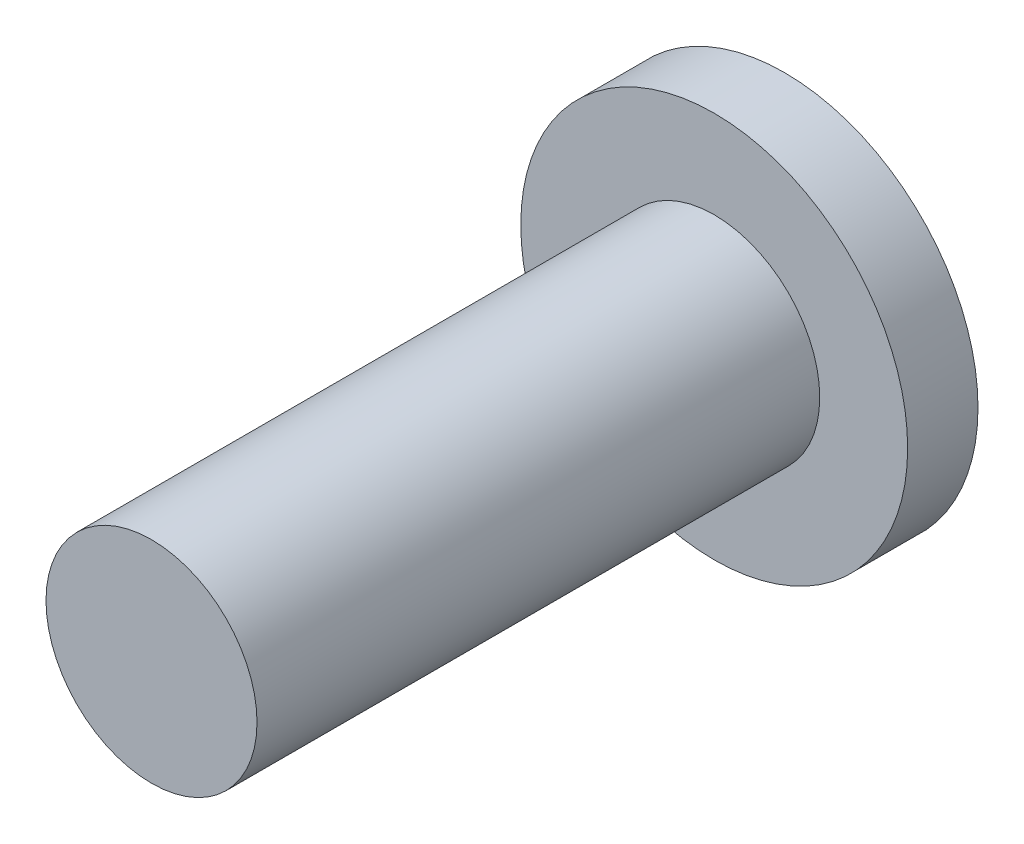
ISO-10303-21;
HEADER;
FILE_DESCRIPTION(('STEP AP214'),'2;1');
FILE_NAME('part.step','',(''),(''),'','','');
FILE_SCHEMA(('AUTOMOTIVE_DESIGN { 1 0 10303 214 1 1 1 1 }'));
ENDSEC;
DATA;
#1=APPLICATION_CONTEXT('core data for automotive mechanical design processes');
#2=APPLICATION_PROTOCOL_DEFINITION('international standard','automotive_design',2000,#1);
#3=PRODUCT_CONTEXT('',#1,'mechanical');
#4=PRODUCT('Part','Part','',(#3));
#5=PRODUCT_RELATED_PRODUCT_CATEGORY('part','',(#4));
#6=PRODUCT_DEFINITION_FORMATION('','',#4);
#7=PRODUCT_DEFINITION_CONTEXT('part definition',#1,'design');
#8=PRODUCT_DEFINITION('design','',#6,#7);
#9=PRODUCT_DEFINITION_SHAPE('','',#8);
#10=(LENGTH_UNIT() NAMED_UNIT(*) SI_UNIT(.MILLI.,.METRE.));
#11=(NAMED_UNIT(*) PLANE_ANGLE_UNIT() SI_UNIT($,.RADIAN.));
#12=(NAMED_UNIT(*) SI_UNIT($,.STERADIAN.) SOLID_ANGLE_UNIT());
#13=UNCERTAINTY_MEASURE_WITH_UNIT(LENGTH_MEASURE(1.E-05),#10,'distance_accuracy_value','');
#14=(GEOMETRIC_REPRESENTATION_CONTEXT(3) GLOBAL_UNCERTAINTY_ASSIGNED_CONTEXT((#13)) GLOBAL_UNIT_ASSIGNED_CONTEXT((#10,
#11,#12)) REPRESENTATION_CONTEXT('',''));
#15=CARTESIAN_POINT('',(0.,0.,0.));
#16=DIRECTION('',(0.,0.,1.));
#17=DIRECTION('',(1.,0.,0.));
#18=AXIS2_PLACEMENT_3D('',#15,#16,#17);
#19=CARTESIAN_POINT('',(0.,0.,0.));
#20=DIRECTION('',(0.,0.,1.));
#21=DIRECTION('',(1.,0.,0.));
#22=AXIS2_PLACEMENT_3D('',#19,#20,#21);
#23=PLANE('',#22);
#24=CARTESIAN_POINT('',(0.,0.,0.));
#25=DIRECTION('',(0.,0.,1.));
#26=DIRECTION('',(1.,0.,0.));
#27=AXIS2_PLACEMENT_3D('',#24,#25,#26);
#28=CIRCLE('',#27,2.75);
#29=CARTESIAN_POINT('',(2.75,0.,0.));
#30=VERTEX_POINT('',#29);
#31=EDGE_CURVE('E41',#30,#30,#28,.T.);
#32=ORIENTED_EDGE('',*,*,#31,.F.);
#33=EDGE_LOOP('',(#32));
#34=FACE_BOUND('',#33,.T.);
#35=DIRECTION('',(0.,1.,0.));
#36=VECTOR('',#35,1.);
#37=CARTESIAN_POINT('',(0.5,0.,0.));
#38=LINE('',#37,#36);
#39=CARTESIAN_POINT('',(0.5,0.5,0.));
#40=VERTEX_POINT('',#39);
#41=CARTESIAN_POINT('',(0.5,1.5,0.));
#42=VERTEX_POINT('',#41);
#43=EDGE_CURVE('E52',#40,#42,#38,.T.);
#44=ORIENTED_EDGE('',*,*,#43,.T.);
#45=DIRECTION('',(-1.,0.,0.));
#46=VECTOR('',#45,1.);
#47=CARTESIAN_POINT('',(0.,1.5,0.));
#48=LINE('',#47,#46);
#49=CARTESIAN_POINT('',(-0.5,1.5,0.));
#50=VERTEX_POINT('',#49);
#51=EDGE_CURVE('E102',#42,#50,#48,.T.);
#52=ORIENTED_EDGE('',*,*,#51,.T.);
#53=DIRECTION('',(0.,1.,0.));
#54=VECTOR('',#53,1.);
#55=CARTESIAN_POINT('',(-0.5,0.,0.));
#56=LINE('',#55,#54);
#57=CARTESIAN_POINT('',(-0.5,0.5,0.));
#58=VERTEX_POINT('',#57);
#59=EDGE_CURVE('E190',#58,#50,#56,.T.);
#60=ORIENTED_EDGE('',*,*,#59,.F.);
#61=DIRECTION('',(-1.,0.,0.));
#62=VECTOR('',#61,1.);
#63=CARTESIAN_POINT('',(0.,0.5,0.));
#64=LINE('',#63,#62);
#65=CARTESIAN_POINT('',(-1.5,0.5,0.));
#66=VERTEX_POINT('',#65);
#67=EDGE_CURVE('E142',#58,#66,#64,.T.);
#68=ORIENTED_EDGE('',*,*,#67,.T.);
#69=DIRECTION('',(0.,1.,0.));
#70=VECTOR('',#69,1.);
#71=CARTESIAN_POINT('',(-1.5,0.,0.));
#72=LINE('',#71,#70);
#73=CARTESIAN_POINT('',(-1.5,-0.5,0.));
#74=VERTEX_POINT('',#73);
#75=EDGE_CURVE('E186',#74,#66,#72,.T.);
#76=ORIENTED_EDGE('',*,*,#75,.F.);
#77=DIRECTION('',(-1.,0.,0.));
#78=VECTOR('',#77,1.);
#79=CARTESIAN_POINT('',(0.,-0.5,0.));
#80=LINE('',#79,#78);
#81=CARTESIAN_POINT('',(-0.5,-0.5,0.));
#82=VERTEX_POINT('',#81);
#83=EDGE_CURVE('E183',#82,#74,#80,.T.);
#84=ORIENTED_EDGE('',*,*,#83,.F.);
#85=DIRECTION('',(0.,1.,0.));
#86=VECTOR('',#85,1.);
#87=CARTESIAN_POINT('',(-0.5,0.,0.));
#88=LINE('',#87,#86);
#89=CARTESIAN_POINT('',(-0.5,-1.5,0.));
#90=VERTEX_POINT('',#89);
#91=EDGE_CURVE('E180',#90,#82,#88,.T.);
#92=ORIENTED_EDGE('',*,*,#91,.F.);
#93=DIRECTION('',(-1.,0.,0.));
#94=VECTOR('',#93,1.);
#95=CARTESIAN_POINT('',(0.,-1.5,0.));
#96=LINE('',#95,#94);
#97=CARTESIAN_POINT('',(0.5,-1.5,0.));
#98=VERTEX_POINT('',#97);
#99=EDGE_CURVE('E177',#98,#90,#96,.T.);
#100=ORIENTED_EDGE('',*,*,#99,.F.);
#101=DIRECTION('',(0.,1.,0.));
#102=VECTOR('',#101,1.);
#103=CARTESIAN_POINT('',(0.5,0.,0.));
#104=LINE('',#103,#102);
#105=CARTESIAN_POINT('',(0.5,-0.5,0.));
#106=VERTEX_POINT('',#105);
#107=EDGE_CURVE('E174',#98,#106,#104,.T.);
#108=ORIENTED_EDGE('',*,*,#107,.T.);
#109=DIRECTION('',(-1.,0.,0.));
#110=VECTOR('',#109,1.);
#111=CARTESIAN_POINT('',(0.,-0.5,0.));
#112=LINE('',#111,#110);
#113=CARTESIAN_POINT('',(1.5,-0.5,0.));
#114=VERTEX_POINT('',#113);
#115=EDGE_CURVE('E171',#114,#106,#112,.T.);
#116=ORIENTED_EDGE('',*,*,#115,.F.);
#117=DIRECTION('',(0.,1.,0.));
#118=VECTOR('',#117,1.);
#119=CARTESIAN_POINT('',(1.5,0.,0.));
#120=LINE('',#119,#118);
#121=CARTESIAN_POINT('',(1.5,0.5,0.));
#122=VERTEX_POINT('',#121);
#123=EDGE_CURVE('E168',#114,#122,#120,.T.);
#124=ORIENTED_EDGE('',*,*,#123,.T.);
#125=DIRECTION('',(-1.,0.,0.));
#126=VECTOR('',#125,1.);
#127=CARTESIAN_POINT('',(0.,0.5,0.));
#128=LINE('',#127,#126);
#129=EDGE_CURVE('E165',#122,#40,#128,.T.);
#130=ORIENTED_EDGE('',*,*,#129,.T.);
#131=EDGE_LOOP('',(#44,#52,#60,#68,#76,#84,#92,#100,#108,#116,#124,#130));
#132=FACE_BOUND('',#131,.T.);
#133=ADVANCED_FACE('F37',(#34,#132),#23,.F.);
#134=CARTESIAN_POINT('',(0.,0.,1.));
#135=DIRECTION('',(0.,0.,1.));
#136=DIRECTION('',(1.,0.,0.));
#137=AXIS2_PLACEMENT_3D('',#134,#135,#136);
#138=PLANE('',#137);
#139=CARTESIAN_POINT('',(0.,0.,1.));
#140=DIRECTION('',(0.,0.,1.));
#141=DIRECTION('',(1.,0.,0.));
#142=AXIS2_PLACEMENT_3D('',#139,#140,#141);
#143=CIRCLE('',#142,2.75);
#144=CARTESIAN_POINT('',(2.75,0.,1.));
#145=VERTEX_POINT('',#144);
#146=EDGE_CURVE('E11',#145,#145,#143,.T.);
#147=ORIENTED_EDGE('',*,*,#146,.T.);
#148=EDGE_LOOP('',(#147));
#149=FACE_BOUND('',#148,.T.);
#150=CARTESIAN_POINT('',(0.,0.,1.));
#151=DIRECTION('',(0.,0.,1.));
#152=DIRECTION('',(1.,0.,0.));
#153=AXIS2_PLACEMENT_3D('',#150,#151,#152);
#154=CIRCLE('',#153,1.5);
#155=CARTESIAN_POINT('',(1.5,0.,1.));
#156=VERTEX_POINT('',#155);
#157=EDGE_CURVE('E196',#156,#156,#154,.T.);
#158=ORIENTED_EDGE('',*,*,#157,.F.);
#159=EDGE_LOOP('',(#158));
#160=FACE_BOUND('',#159,.T.);
#161=ADVANCED_FACE('F222',(#149,#160),#138,.T.);
#162=CARTESIAN_POINT('',(0.,0.,1.));
#163=DIRECTION('',(0.,0.,-1.));
#164=DIRECTION('',(-1.,0.,0.));
#165=AXIS2_PLACEMENT_3D('',#162,#163,#164);
#166=CYLINDRICAL_SURFACE('',#165,2.75);
#167=ORIENTED_EDGE('',*,*,#146,.F.);
#168=EDGE_LOOP('',(#167));
#169=FACE_BOUND('',#168,.T.);
#170=ORIENTED_EDGE('',*,*,#31,.T.);
#171=EDGE_LOOP('',(#170));
#172=FACE_BOUND('',#171,.T.);
#173=ADVANCED_FACE('F39',(#169,#172),#166,.T.);
#174=CARTESIAN_POINT('',(0.,0.,9.));
#175=DIRECTION('',(0.,0.,-1.));
#176=DIRECTION('',(-1.,0.,0.));
#177=AXIS2_PLACEMENT_3D('',#174,#175,#176);
#178=CYLINDRICAL_SURFACE('',#177,1.5);
#179=CARTESIAN_POINT('',(0.,0.,9.));
#180=DIRECTION('',(0.,0.,1.));
#181=DIRECTION('',(1.,0.,0.));
#182=AXIS2_PLACEMENT_3D('',#179,#180,#181);
#183=CIRCLE('',#182,1.5);
#184=CARTESIAN_POINT('',(1.5,0.,9.));
#185=VERTEX_POINT('',#184);
#186=EDGE_CURVE('E214',#185,#185,#183,.T.);
#187=ORIENTED_EDGE('',*,*,#186,.F.);
#188=EDGE_LOOP('',(#187));
#189=FACE_BOUND('',#188,.T.);
#190=ORIENTED_EDGE('',*,*,#157,.T.);
#191=EDGE_LOOP('',(#190));
#192=FACE_BOUND('',#191,.T.);
#193=ADVANCED_FACE('F220',(#189,#192),#178,.T.);
#194=CARTESIAN_POINT('',(0.,0.,9.));
#195=DIRECTION('',(0.,0.,1.));
#196=DIRECTION('',(1.,0.,0.));
#197=AXIS2_PLACEMENT_3D('',#194,#195,#196);
#198=PLANE('',#197);
#199=ORIENTED_EDGE('',*,*,#186,.T.);
#200=EDGE_LOOP('',(#199));
#201=FACE_BOUND('',#200,.T.);
#202=ADVANCED_FACE('F235',(#201),#198,.T.);
#203=CARTESIAN_POINT('',(0.5,0.,0.5));
#204=DIRECTION('',(-1.,0.,0.));
#205=DIRECTION('',(0.,0.,1.));
#206=AXIS2_PLACEMENT_3D('',#203,#204,#205);
#207=PLANE('',#206);
#208=ORIENTED_EDGE('',*,*,#43,.F.);
#209=DIRECTION('',(0.,0.,-1.));
#210=VECTOR('',#209,1.);
#211=CARTESIAN_POINT('',(0.5,0.5,0.5));
#212=LINE('',#211,#210);
#213=CARTESIAN_POINT('',(0.5,0.5,0.5));
#214=VERTEX_POINT('',#213);
#215=EDGE_CURVE('E160',#214,#40,#212,.T.);
#216=ORIENTED_EDGE('',*,*,#215,.F.);
#217=DIRECTION('',(0.,1.,0.));
#218=VECTOR('',#217,1.);
#219=CARTESIAN_POINT('',(0.5,0.,0.5));
#220=LINE('',#219,#218);
#221=CARTESIAN_POINT('',(0.5,1.5,0.5));
#222=VERTEX_POINT('',#221);
#223=EDGE_CURVE('E193',#214,#222,#220,.T.);
#224=ORIENTED_EDGE('',*,*,#223,.T.);
#225=DIRECTION('',(0.,0.,-1.));
#226=VECTOR('',#225,1.);
#227=CARTESIAN_POINT('',(0.5,1.5,0.5));
#228=LINE('',#227,#226);
#229=EDGE_CURVE('E194',#222,#42,#228,.T.);
#230=ORIENTED_EDGE('',*,*,#229,.T.);
#231=EDGE_LOOP('',(#208,#216,#224,#230));
#232=FACE_BOUND('',#231,.T.);
#233=ADVANCED_FACE('F239',(#232),#207,.T.);
#234=CARTESIAN_POINT('',(0.,1.5,0.5));
#235=DIRECTION('',(0.,-1.,0.));
#236=DIRECTION('',(0.,0.,-1.));
#237=AXIS2_PLACEMENT_3D('',#234,#235,#236);
#238=PLANE('',#237);
#239=ORIENTED_EDGE('',*,*,#51,.F.);
#240=ORIENTED_EDGE('',*,*,#229,.F.);
#241=DIRECTION('',(-1.,0.,0.));
#242=VECTOR('',#241,1.);
#243=CARTESIAN_POINT('',(0.,1.5,0.5));
#244=LINE('',#243,#242);
#245=CARTESIAN_POINT('',(-0.5,1.5,0.5));
#246=VERTEX_POINT('',#245);
#247=EDGE_CURVE('E61',#222,#246,#244,.T.);
#248=ORIENTED_EDGE('',*,*,#247,.T.);
#249=DIRECTION('',(0.,0.,-1.));
#250=VECTOR('',#249,1.);
#251=CARTESIAN_POINT('',(-0.5,1.5,0.5));
#252=LINE('',#251,#250);
#253=EDGE_CURVE('E147',#246,#50,#252,.T.);
#254=ORIENTED_EDGE('',*,*,#253,.T.);
#255=EDGE_LOOP('',(#239,#240,#248,#254));
#256=FACE_BOUND('',#255,.T.);
#257=ADVANCED_FACE('F243',(#256),#238,.T.);
#258=CARTESIAN_POINT('',(-0.5,0.,0.5));
#259=DIRECTION('',(-1.,0.,0.));
#260=DIRECTION('',(0.,0.,1.));
#261=AXIS2_PLACEMENT_3D('',#258,#259,#260);
#262=PLANE('',#261);
#263=ORIENTED_EDGE('',*,*,#59,.T.);
#264=ORIENTED_EDGE('',*,*,#253,.F.);
#265=DIRECTION('',(0.,1.,0.));
#266=VECTOR('',#265,1.);
#267=CARTESIAN_POINT('',(-0.5,0.,0.5));
#268=LINE('',#267,#266);
#269=CARTESIAN_POINT('',(-0.5,0.5,0.5));
#270=VERTEX_POINT('',#269);
#271=EDGE_CURVE('E152',#270,#246,#268,.T.);
#272=ORIENTED_EDGE('',*,*,#271,.F.);
#273=DIRECTION('',(0.,0.,-1.));
#274=VECTOR('',#273,1.);
#275=CARTESIAN_POINT('',(-0.5,0.5,0.5));
#276=LINE('',#275,#274);
#277=EDGE_CURVE('E136',#270,#58,#276,.T.);
#278=ORIENTED_EDGE('',*,*,#277,.T.);
#279=EDGE_LOOP('',(#263,#264,#272,#278));
#280=FACE_BOUND('',#279,.T.);
#281=ADVANCED_FACE('F158',(#280),#262,.F.);
#282=CARTESIAN_POINT('',(0.,0.5,0.5));
#283=DIRECTION('',(0.,-1.,0.));
#284=DIRECTION('',(0.,0.,-1.));
#285=AXIS2_PLACEMENT_3D('',#282,#283,#284);
#286=PLANE('',#285);
#287=ORIENTED_EDGE('',*,*,#67,.F.);
#288=ORIENTED_EDGE('',*,*,#277,.F.);
#289=DIRECTION('',(-1.,0.,0.));
#290=VECTOR('',#289,1.);
#291=CARTESIAN_POINT('',(0.,0.5,0.5));
#292=LINE('',#291,#290);
#293=CARTESIAN_POINT('',(-1.5,0.5,0.5));
#294=VERTEX_POINT('',#293);
#295=EDGE_CURVE('E139',#270,#294,#292,.T.);
#296=ORIENTED_EDGE('',*,*,#295,.T.);
#297=DIRECTION('',(0.,0.,-1.));
#298=VECTOR('',#297,1.);
#299=CARTESIAN_POINT('',(-1.5,0.5,0.5));
#300=LINE('',#299,#298);
#301=EDGE_CURVE('E148',#294,#66,#300,.T.);
#302=ORIENTED_EDGE('',*,*,#301,.T.);
#303=EDGE_LOOP('',(#287,#288,#296,#302));
#304=FACE_BOUND('',#303,.T.);
#305=ADVANCED_FACE('F138',(#304),#286,.T.);
#306=CARTESIAN_POINT('',(-1.5,0.,0.5));
#307=DIRECTION('',(-1.,0.,0.));
#308=DIRECTION('',(0.,0.,1.));
#309=AXIS2_PLACEMENT_3D('',#306,#307,#308);
#310=PLANE('',#309);
#311=ORIENTED_EDGE('',*,*,#75,.T.);
#312=ORIENTED_EDGE('',*,*,#301,.F.);
#313=DIRECTION('',(0.,1.,0.));
#314=VECTOR('',#313,1.);
#315=CARTESIAN_POINT('',(-1.5,0.,0.5));
#316=LINE('',#315,#314);
#317=CARTESIAN_POINT('',(-1.5,-0.5,0.5));
#318=VERTEX_POINT('',#317);
#319=EDGE_CURVE('E155',#318,#294,#316,.T.);
#320=ORIENTED_EDGE('',*,*,#319,.F.);
#321=DIRECTION('',(0.,0.,-1.));
#322=VECTOR('',#321,1.);
#323=CARTESIAN_POINT('',(-1.5,-0.5,0.5));
#324=LINE('',#323,#322);
#325=EDGE_CURVE('E199',#318,#74,#324,.T.);
#326=ORIENTED_EDGE('',*,*,#325,.T.);
#327=EDGE_LOOP('',(#311,#312,#320,#326));
#328=FACE_BOUND('',#327,.T.);
#329=ADVANCED_FACE('F270',(#328),#310,.F.);
#330=CARTESIAN_POINT('',(0.,-0.5,0.5));
#331=DIRECTION('',(0.,-1.,0.));
#332=DIRECTION('',(0.,0.,-1.));
#333=AXIS2_PLACEMENT_3D('',#330,#331,#332);
#334=PLANE('',#333);
#335=ORIENTED_EDGE('',*,*,#83,.T.);
#336=ORIENTED_EDGE('',*,*,#325,.F.);
#337=DIRECTION('',(-1.,0.,0.));
#338=VECTOR('',#337,1.);
#339=CARTESIAN_POINT('',(0.,-0.5,0.5));
#340=LINE('',#339,#338);
#341=CARTESIAN_POINT('',(-0.5,-0.5,0.5));
#342=VERTEX_POINT('',#341);
#343=EDGE_CURVE('E434',#342,#318,#340,.T.);
#344=ORIENTED_EDGE('',*,*,#343,.F.);
#345=DIRECTION('',(0.,0.,-1.));
#346=VECTOR('',#345,1.);
#347=CARTESIAN_POINT('',(-0.5,-0.5,0.5));
#348=LINE('',#347,#346);
#349=EDGE_CURVE('E201',#342,#82,#348,.T.);
#350=ORIENTED_EDGE('',*,*,#349,.T.);
#351=EDGE_LOOP('',(#335,#336,#344,#350));
#352=FACE_BOUND('',#351,.T.);
#353=ADVANCED_FACE('F266',(#352),#334,.F.);
#354=CARTESIAN_POINT('',(-0.5,0.,0.5));
#355=DIRECTION('',(-1.,0.,0.));
#356=DIRECTION('',(0.,0.,1.));
#357=AXIS2_PLACEMENT_3D('',#354,#355,#356);
#358=PLANE('',#357);
#359=ORIENTED_EDGE('',*,*,#91,.T.);
#360=ORIENTED_EDGE('',*,*,#349,.F.);
#361=DIRECTION('',(0.,1.,0.));
#362=VECTOR('',#361,1.);
#363=CARTESIAN_POINT('',(-0.5,0.,0.5));
#364=LINE('',#363,#362);
#365=CARTESIAN_POINT('',(-0.5,-1.5,0.5));
#366=VERTEX_POINT('',#365);
#367=EDGE_CURVE('E431',#366,#342,#364,.T.);
#368=ORIENTED_EDGE('',*,*,#367,.F.);
#369=DIRECTION('',(0.,0.,-1.));
#370=VECTOR('',#369,1.);
#371=CARTESIAN_POINT('',(-0.5,-1.5,0.5));
#372=LINE('',#371,#370);
#373=EDGE_CURVE('E203',#366,#90,#372,.T.);
#374=ORIENTED_EDGE('',*,*,#373,.T.);
#375=EDGE_LOOP('',(#359,#360,#368,#374));
#376=FACE_BOUND('',#375,.T.);
#377=ADVANCED_FACE('F262',(#376),#358,.F.);
#378=CARTESIAN_POINT('',(0.,-1.5,0.5));
#379=DIRECTION('',(0.,-1.,0.));
#380=DIRECTION('',(0.,0.,-1.));
#381=AXIS2_PLACEMENT_3D('',#378,#379,#380);
#382=PLANE('',#381);
#383=ORIENTED_EDGE('',*,*,#99,.T.);
#384=ORIENTED_EDGE('',*,*,#373,.F.);
#385=DIRECTION('',(-1.,0.,0.));
#386=VECTOR('',#385,1.);
#387=CARTESIAN_POINT('',(0.,-1.5,0.5));
#388=LINE('',#387,#386);
#389=CARTESIAN_POINT('',(0.5,-1.5,0.5));
#390=VERTEX_POINT('',#389);
#391=EDGE_CURVE('E428',#390,#366,#388,.T.);
#392=ORIENTED_EDGE('',*,*,#391,.F.);
#393=DIRECTION('',(0.,0.,-1.));
#394=VECTOR('',#393,1.);
#395=CARTESIAN_POINT('',(0.5,-1.5,0.5));
#396=LINE('',#395,#394);
#397=EDGE_CURVE('E205',#390,#98,#396,.T.);
#398=ORIENTED_EDGE('',*,*,#397,.T.);
#399=EDGE_LOOP('',(#383,#384,#392,#398));
#400=FACE_BOUND('',#399,.T.);
#401=ADVANCED_FACE('F258',(#400),#382,.F.);
#402=CARTESIAN_POINT('',(0.5,0.,0.5));
#403=DIRECTION('',(-1.,0.,0.));
#404=DIRECTION('',(0.,0.,1.));
#405=AXIS2_PLACEMENT_3D('',#402,#403,#404);
#406=PLANE('',#405);
#407=ORIENTED_EDGE('',*,*,#107,.F.);
#408=ORIENTED_EDGE('',*,*,#397,.F.);
#409=DIRECTION('',(0.,1.,0.));
#410=VECTOR('',#409,1.);
#411=CARTESIAN_POINT('',(0.5,0.,0.5));
#412=LINE('',#411,#410);
#413=CARTESIAN_POINT('',(0.5,-0.5,0.5));
#414=VERTEX_POINT('',#413);
#415=EDGE_CURVE('E426',#390,#414,#412,.T.);
#416=ORIENTED_EDGE('',*,*,#415,.T.);
#417=DIRECTION('',(0.,0.,-1.));
#418=VECTOR('',#417,1.);
#419=CARTESIAN_POINT('',(0.5,-0.5,0.5));
#420=LINE('',#419,#418);
#421=EDGE_CURVE('E207',#414,#106,#420,.T.);
#422=ORIENTED_EDGE('',*,*,#421,.T.);
#423=EDGE_LOOP('',(#407,#408,#416,#422));
#424=FACE_BOUND('',#423,.T.);
#425=ADVANCED_FACE('F254',(#424),#406,.T.);
#426=CARTESIAN_POINT('',(0.,-0.5,0.5));
#427=DIRECTION('',(0.,-1.,0.));
#428=DIRECTION('',(0.,0.,-1.));
#429=AXIS2_PLACEMENT_3D('',#426,#427,#428);
#430=PLANE('',#429);
#431=ORIENTED_EDGE('',*,*,#115,.T.);
#432=ORIENTED_EDGE('',*,*,#421,.F.);
#433=DIRECTION('',(-1.,0.,0.));
#434=VECTOR('',#433,1.);
#435=CARTESIAN_POINT('',(0.,-0.5,0.5));
#436=LINE('',#435,#434);
#437=CARTESIAN_POINT('',(1.5,-0.5,0.5));
#438=VERTEX_POINT('',#437);
#439=EDGE_CURVE('E423',#438,#414,#436,.T.);
#440=ORIENTED_EDGE('',*,*,#439,.F.);
#441=DIRECTION('',(0.,0.,-1.));
#442=VECTOR('',#441,1.);
#443=CARTESIAN_POINT('',(1.5,-0.5,0.5));
#444=LINE('',#443,#442);
#445=EDGE_CURVE('E209',#438,#114,#444,.T.);
#446=ORIENTED_EDGE('',*,*,#445,.T.);
#447=EDGE_LOOP('',(#431,#432,#440,#446));
#448=FACE_BOUND('',#447,.T.);
#449=ADVANCED_FACE('F250',(#448),#430,.F.);
#450=CARTESIAN_POINT('',(1.5,0.,0.5));
#451=DIRECTION('',(-1.,0.,0.));
#452=DIRECTION('',(0.,0.,1.));
#453=AXIS2_PLACEMENT_3D('',#450,#451,#452);
#454=PLANE('',#453);
#455=ORIENTED_EDGE('',*,*,#123,.F.);
#456=ORIENTED_EDGE('',*,*,#445,.F.);
#457=DIRECTION('',(0.,1.,0.));
#458=VECTOR('',#457,1.);
#459=CARTESIAN_POINT('',(1.5,0.,0.5));
#460=LINE('',#459,#458);
#461=CARTESIAN_POINT('',(1.5,0.5,0.5));
#462=VERTEX_POINT('',#461);
#463=EDGE_CURVE('E419',#438,#462,#460,.T.);
#464=ORIENTED_EDGE('',*,*,#463,.T.);
#465=DIRECTION('',(0.,0.,-1.));
#466=VECTOR('',#465,1.);
#467=CARTESIAN_POINT('',(1.5,0.5,0.5));
#468=LINE('',#467,#466);
#469=EDGE_CURVE('E211',#462,#122,#468,.T.);
#470=ORIENTED_EDGE('',*,*,#469,.T.);
#471=EDGE_LOOP('',(#455,#456,#464,#470));
#472=FACE_BOUND('',#471,.T.);
#473=ADVANCED_FACE('F247',(#472),#454,.T.);
#474=CARTESIAN_POINT('',(0.,0.5,0.5));
#475=DIRECTION('',(0.,-1.,0.));
#476=DIRECTION('',(0.,0.,-1.));
#477=AXIS2_PLACEMENT_3D('',#474,#475,#476);
#478=PLANE('',#477);
#479=ORIENTED_EDGE('',*,*,#129,.F.);
#480=ORIENTED_EDGE('',*,*,#469,.F.);
#481=DIRECTION('',(-1.,0.,0.));
#482=VECTOR('',#481,1.);
#483=CARTESIAN_POINT('',(0.,0.5,0.5));
#484=LINE('',#483,#482);
#485=EDGE_CURVE('E109',#462,#214,#484,.T.);
#486=ORIENTED_EDGE('',*,*,#485,.T.);
#487=ORIENTED_EDGE('',*,*,#215,.T.);
#488=EDGE_LOOP('',(#479,#480,#486,#487));
#489=FACE_BOUND('',#488,.T.);
#490=ADVANCED_FACE('F244',(#489),#478,.T.);
#491=CARTESIAN_POINT('',(0.,0.,0.5));
#492=DIRECTION('',(0.,0.,-1.));
#493=DIRECTION('',(-1.,0.,0.));
#494=AXIS2_PLACEMENT_3D('',#491,#492,#493);
#495=PLANE('',#494);
#496=ORIENTED_EDGE('',*,*,#223,.F.);
#497=ORIENTED_EDGE('',*,*,#485,.F.);
#498=ORIENTED_EDGE('',*,*,#463,.F.);
#499=ORIENTED_EDGE('',*,*,#439,.T.);
#500=ORIENTED_EDGE('',*,*,#415,.F.);
#501=ORIENTED_EDGE('',*,*,#391,.T.);
#502=ORIENTED_EDGE('',*,*,#367,.T.);
#503=ORIENTED_EDGE('',*,*,#343,.T.);
#504=ORIENTED_EDGE('',*,*,#319,.T.);
#505=ORIENTED_EDGE('',*,*,#295,.F.);
#506=ORIENTED_EDGE('',*,*,#271,.T.);
#507=ORIENTED_EDGE('',*,*,#247,.F.);
#508=EDGE_LOOP('',(#496,#497,#498,#499,#500,#501,#502,#503,#504,#505,#506,#507));
#509=FACE_BOUND('',#508,.T.);
#510=ADVANCED_FACE('F151',(#509),#495,.T.);
#511=CLOSED_SHELL('',(#133,#161,#173,#193,#202,#233,#257,#281,#305,#329,#353,#377,#401,#425,
#449,#473,#490,#510));
#512=MANIFOLD_SOLID_BREP('B2',#511);
#513=ADVANCED_BREP_SHAPE_REPRESENTATION('',(#18,#512),#14);
#514=SHAPE_DEFINITION_REPRESENTATION(#9,#513);
ENDSEC;
END-ISO-10303-21;
